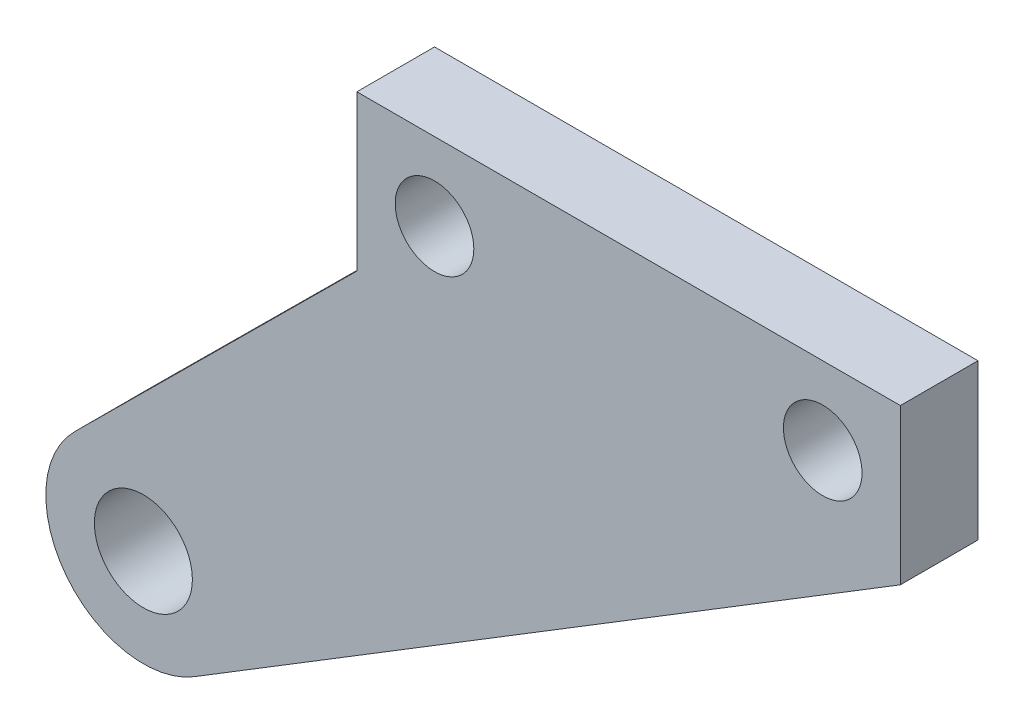
ISO-10303-21;
HEADER;
FILE_DESCRIPTION(('STEP AP214'),'2;1');
FILE_NAME('part.step','',(''),(''),'','','');
FILE_SCHEMA(('AUTOMOTIVE_DESIGN { 1 0 10303 214 1 1 1 1 }'));
ENDSEC;
DATA;
#1=APPLICATION_CONTEXT('core data for automotive mechanical design processes');
#2=APPLICATION_PROTOCOL_DEFINITION('international standard','automotive_design',2000,#1);
#3=PRODUCT_CONTEXT('',#1,'mechanical');
#4=PRODUCT('Part','Part','',(#3));
#5=PRODUCT_RELATED_PRODUCT_CATEGORY('part','',(#4));
#6=PRODUCT_DEFINITION_FORMATION('','',#4);
#7=PRODUCT_DEFINITION_CONTEXT('part definition',#1,'design');
#8=PRODUCT_DEFINITION('design','',#6,#7);
#9=PRODUCT_DEFINITION_SHAPE('','',#8);
#10=(LENGTH_UNIT() NAMED_UNIT(*) SI_UNIT(.MILLI.,.METRE.));
#11=(NAMED_UNIT(*) PLANE_ANGLE_UNIT() SI_UNIT($,.RADIAN.));
#12=(NAMED_UNIT(*) SI_UNIT($,.STERADIAN.) SOLID_ANGLE_UNIT());
#13=UNCERTAINTY_MEASURE_WITH_UNIT(LENGTH_MEASURE(1.E-05),#10,'distance_accuracy_value','');
#14=(GEOMETRIC_REPRESENTATION_CONTEXT(3) GLOBAL_UNCERTAINTY_ASSIGNED_CONTEXT((#13)) GLOBAL_UNIT_ASSIGNED_CONTEXT((#10,
#11,#12)) REPRESENTATION_CONTEXT('',''));
#15=CARTESIAN_POINT('',(0.,0.,0.));
#16=DIRECTION('',(0.,0.,1.));
#17=DIRECTION('',(1.,0.,0.));
#18=AXIS2_PLACEMENT_3D('',#15,#16,#17);
#19=CARTESIAN_POINT('',(-25.,-22.,2.));
#20=DIRECTION('',(0.,0.,1.));
#21=DIRECTION('',(1.,0.,0.));
#22=AXIS2_PLACEMENT_3D('',#19,#20,#21);
#23=PLANE('',#22);
#24=CARTESIAN_POINT('',(-10.,0.,2.));
#25=DIRECTION('',(0.,0.,1.));
#26=DIRECTION('',(1.,0.,0.));
#27=AXIS2_PLACEMENT_3D('',#24,#25,#26);
#28=CIRCLE('',#27,2.025);
#29=CARTESIAN_POINT('',(-7.975,0.,2.));
#30=VERTEX_POINT('',#29);
#31=EDGE_CURVE('E186',#30,#30,#28,.T.);
#32=ORIENTED_EDGE('',*,*,#31,.F.);
#33=EDGE_LOOP('',(#32));
#34=FACE_BOUND('',#33,.T.);
#35=DIRECTION('',(0.,-1.,0.));
#36=VECTOR('',#35,1.);
#37=CARTESIAN_POINT('',(-14.,4.,2.));
#38=LINE('',#37,#36);
#39=CARTESIAN_POINT('',(-14.,4.,2.));
#40=VERTEX_POINT('',#39);
#41=CARTESIAN_POINT('',(-14.,-4.,2.));
#42=VERTEX_POINT('',#41);
#43=EDGE_CURVE('E131',#40,#42,#38,.T.);
#44=ORIENTED_EDGE('',*,*,#43,.T.);
#45=DIRECTION('',(-0.709698080789205,-0.704505950382336,0.));
#46=VECTOR('',#45,1.);
#47=CARTESIAN_POINT('',(-14.,-4.,2.));
#48=LINE('',#47,#46);
#49=CARTESIAN_POINT('',(-28.5401424006712,-18.4337671440342,2.));
#50=VERTEX_POINT('',#49);
#51=EDGE_CURVE('E89',#42,#50,#48,.T.);
#52=ORIENTED_EDGE('',*,*,#51,.T.);
#53=CARTESIAN_POINT('',(-25.,-22.,2.));
#54=DIRECTION('',(0.,0.,1.));
#55=DIRECTION('',(1.,0.,0.));
#56=AXIS2_PLACEMENT_3D('',#53,#54,#55);
#57=CIRCLE('',#56,5.025);
#58=CARTESIAN_POINT('',(-22.3749389928446,-26.2848196821701,2.));
#59=VERTEX_POINT('',#58);
#60=EDGE_CURVE('E102',#50,#59,#57,.T.);
#61=ORIENTED_EDGE('',*,*,#60,.T.);
#62=DIRECTION('',(0.852700434262704,0.52240020042894,0.));
#63=VECTOR('',#62,1.);
#64=CARTESIAN_POINT('',(14.,-4.,2.));
#65=LINE('',#64,#63);
#66=CARTESIAN_POINT('',(14.,-4.,2.));
#67=VERTEX_POINT('',#66);
#68=EDGE_CURVE('E96',#59,#67,#65,.T.);
#69=ORIENTED_EDGE('',*,*,#68,.T.);
#70=DIRECTION('',(0.,1.,0.));
#71=VECTOR('',#70,1.);
#72=CARTESIAN_POINT('',(14.,4.,2.));
#73=LINE('',#72,#71);
#74=CARTESIAN_POINT('',(14.,4.,2.));
#75=VERTEX_POINT('',#74);
#76=EDGE_CURVE('E100',#67,#75,#73,.T.);
#77=ORIENTED_EDGE('',*,*,#76,.T.);
#78=DIRECTION('',(-1.,0.,0.));
#79=VECTOR('',#78,1.);
#80=CARTESIAN_POINT('',(-14.,4.,2.));
#81=LINE('',#80,#79);
#82=EDGE_CURVE('E52',#75,#40,#81,.T.);
#83=ORIENTED_EDGE('',*,*,#82,.T.);
#84=EDGE_LOOP('',(#44,#52,#61,#69,#77,#83));
#85=FACE_BOUND('',#84,.T.);
#86=CARTESIAN_POINT('',(10.,0.,2.));
#87=DIRECTION('',(0.,0.,1.));
#88=DIRECTION('',(1.,0.,0.));
#89=AXIS2_PLACEMENT_3D('',#86,#87,#88);
#90=CIRCLE('',#89,2.025);
#91=CARTESIAN_POINT('',(12.025,0.,2.));
#92=VERTEX_POINT('',#91);
#93=EDGE_CURVE('E124',#92,#92,#90,.T.);
#94=ORIENTED_EDGE('',*,*,#93,.F.);
#95=EDGE_LOOP('',(#94));
#96=FACE_BOUND('',#95,.T.);
#97=CARTESIAN_POINT('',(-25.,-22.,2.));
#98=DIRECTION('',(0.,0.,1.));
#99=DIRECTION('',(1.,0.,0.));
#100=AXIS2_PLACEMENT_3D('',#97,#98,#99);
#101=CIRCLE('',#100,2.525);
#102=CARTESIAN_POINT('',(-22.475,-22.,2.));
#103=VERTEX_POINT('',#102);
#104=EDGE_CURVE('E177',#103,#103,#101,.T.);
#105=ORIENTED_EDGE('',*,*,#104,.F.);
#106=EDGE_LOOP('',(#105));
#107=FACE_BOUND('',#106,.T.);
#108=ADVANCED_FACE('F35',(#34,#85,#96,#107),#23,.T.);
#109=CARTESIAN_POINT('',(-25.,-22.,-2.));
#110=DIRECTION('',(0.,0.,1.));
#111=DIRECTION('',(1.,0.,0.));
#112=AXIS2_PLACEMENT_3D('',#109,#110,#111);
#113=PLANE('',#112);
#114=DIRECTION('',(0.,-1.,0.));
#115=VECTOR('',#114,1.);
#116=CARTESIAN_POINT('',(-14.,4.,-2.));
#117=LINE('',#116,#115);
#118=CARTESIAN_POINT('',(-14.,4.,-2.));
#119=VERTEX_POINT('',#118);
#120=CARTESIAN_POINT('',(-14.,-4.,-2.));
#121=VERTEX_POINT('',#120);
#122=EDGE_CURVE('E120',#119,#121,#117,.T.);
#123=ORIENTED_EDGE('',*,*,#122,.F.);
#124=DIRECTION('',(-1.,0.,0.));
#125=VECTOR('',#124,1.);
#126=CARTESIAN_POINT('',(-14.,4.,-2.));
#127=LINE('',#126,#125);
#128=CARTESIAN_POINT('',(14.,4.,-2.));
#129=VERTEX_POINT('',#128);
#130=EDGE_CURVE('E81',#129,#119,#127,.T.);
#131=ORIENTED_EDGE('',*,*,#130,.F.);
#132=DIRECTION('',(0.,1.,0.));
#133=VECTOR('',#132,1.);
#134=CARTESIAN_POINT('',(14.,4.,-2.));
#135=LINE('',#134,#133);
#136=CARTESIAN_POINT('',(14.,-4.,-2.));
#137=VERTEX_POINT('',#136);
#138=EDGE_CURVE('E75',#137,#129,#135,.T.);
#139=ORIENTED_EDGE('',*,*,#138,.F.);
#140=DIRECTION('',(0.852700434262704,0.52240020042894,0.));
#141=VECTOR('',#140,1.);
#142=CARTESIAN_POINT('',(14.,-4.,-2.));
#143=LINE('',#142,#141);
#144=CARTESIAN_POINT('',(-22.3749389928446,-26.2848196821701,-2.));
#145=VERTEX_POINT('',#144);
#146=EDGE_CURVE('E110',#145,#137,#143,.T.);
#147=ORIENTED_EDGE('',*,*,#146,.F.);
#148=CARTESIAN_POINT('',(-25.,-22.,-2.));
#149=DIRECTION('',(0.,0.,1.));
#150=DIRECTION('',(1.,0.,0.));
#151=AXIS2_PLACEMENT_3D('',#148,#149,#150);
#152=CIRCLE('',#151,5.025);
#153=CARTESIAN_POINT('',(-28.5401424006712,-18.4337671440342,-2.));
#154=VERTEX_POINT('',#153);
#155=EDGE_CURVE('E126',#154,#145,#152,.T.);
#156=ORIENTED_EDGE('',*,*,#155,.F.);
#157=DIRECTION('',(-0.709698080789205,-0.704505950382336,0.));
#158=VECTOR('',#157,1.);
#159=CARTESIAN_POINT('',(-14.,-4.,-2.));
#160=LINE('',#159,#158);
#161=EDGE_CURVE('E123',#121,#154,#160,.T.);
#162=ORIENTED_EDGE('',*,*,#161,.F.);
#163=EDGE_LOOP('',(#123,#131,#139,#147,#156,#162));
#164=FACE_BOUND('',#163,.T.);
#165=CARTESIAN_POINT('',(10.,0.,-2.));
#166=DIRECTION('',(0.,0.,1.));
#167=DIRECTION('',(1.,0.,0.));
#168=AXIS2_PLACEMENT_3D('',#165,#166,#167);
#169=CIRCLE('',#168,2.025);
#170=CARTESIAN_POINT('',(12.025,0.,-2.));
#171=VERTEX_POINT('',#170);
#172=EDGE_CURVE('E189',#171,#171,#169,.T.);
#173=ORIENTED_EDGE('',*,*,#172,.T.);
#174=EDGE_LOOP('',(#173));
#175=FACE_BOUND('',#174,.T.);
#176=CARTESIAN_POINT('',(-10.,0.,-2.));
#177=DIRECTION('',(0.,0.,1.));
#178=DIRECTION('',(1.,0.,0.));
#179=AXIS2_PLACEMENT_3D('',#176,#177,#178);
#180=CIRCLE('',#179,2.025);
#181=CARTESIAN_POINT('',(-7.975,0.,-2.));
#182=VERTEX_POINT('',#181);
#183=EDGE_CURVE('E183',#182,#182,#180,.T.);
#184=ORIENTED_EDGE('',*,*,#183,.T.);
#185=EDGE_LOOP('',(#184));
#186=FACE_BOUND('',#185,.T.);
#187=CARTESIAN_POINT('',(-25.,-22.,-2.));
#188=DIRECTION('',(0.,0.,1.));
#189=DIRECTION('',(1.,0.,0.));
#190=AXIS2_PLACEMENT_3D('',#187,#188,#189);
#191=CIRCLE('',#190,2.525);
#192=CARTESIAN_POINT('',(-22.475,-22.,-2.));
#193=VERTEX_POINT('',#192);
#194=EDGE_CURVE('E180',#193,#193,#191,.T.);
#195=ORIENTED_EDGE('',*,*,#194,.T.);
#196=EDGE_LOOP('',(#195));
#197=FACE_BOUND('',#196,.T.);
#198=ADVANCED_FACE('F140',(#164,#175,#186,#197),#113,.F.);
#199=CARTESIAN_POINT('',(-14.,4.,2.));
#200=DIRECTION('',(1.,0.,0.));
#201=DIRECTION('',(0.,1.,0.));
#202=AXIS2_PLACEMENT_3D('',#199,#200,#201);
#203=PLANE('',#202);
#204=ORIENTED_EDGE('',*,*,#122,.T.);
#205=DIRECTION('',(0.,0.,-1.));
#206=VECTOR('',#205,1.);
#207=CARTESIAN_POINT('',(-14.,-4.,2.));
#208=LINE('',#207,#206);
#209=EDGE_CURVE('E11',#42,#121,#208,.T.);
#210=ORIENTED_EDGE('',*,*,#209,.F.);
#211=ORIENTED_EDGE('',*,*,#43,.F.);
#212=DIRECTION('',(0.,0.,-1.));
#213=VECTOR('',#212,1.);
#214=CARTESIAN_POINT('',(-14.,4.,2.));
#215=LINE('',#214,#213);
#216=EDGE_CURVE('E116',#40,#119,#215,.T.);
#217=ORIENTED_EDGE('',*,*,#216,.T.);
#218=EDGE_LOOP('',(#204,#210,#211,#217));
#219=FACE_BOUND('',#218,.T.);
#220=ADVANCED_FACE('F37',(#219),#203,.F.);
#221=CARTESIAN_POINT('',(-14.,-4.,2.));
#222=DIRECTION('',(0.704505950382336,-0.709698080789206,0.));
#223=DIRECTION('',(0.709698080789206,0.704505950382336,0.));
#224=AXIS2_PLACEMENT_3D('',#221,#222,#223);
#225=PLANE('',#224);
#226=ORIENTED_EDGE('',*,*,#161,.T.);
#227=DIRECTION('',(0.,0.,-1.));
#228=VECTOR('',#227,1.);
#229=CARTESIAN_POINT('',(-28.5401424006712,-18.4337671440342,2.));
#230=LINE('',#229,#228);
#231=EDGE_CURVE('E44',#50,#154,#230,.T.);
#232=ORIENTED_EDGE('',*,*,#231,.F.);
#233=ORIENTED_EDGE('',*,*,#51,.F.);
#234=ORIENTED_EDGE('',*,*,#209,.T.);
#235=EDGE_LOOP('',(#226,#232,#233,#234));
#236=FACE_BOUND('',#235,.T.);
#237=ADVANCED_FACE('F239',(#236),#225,.F.);
#238=CARTESIAN_POINT('',(-25.,-22.,2.));
#239=DIRECTION('',(0.,0.,-1.));
#240=DIRECTION('',(-1.,0.,0.));
#241=AXIS2_PLACEMENT_3D('',#238,#239,#240);
#242=CYLINDRICAL_SURFACE('',#241,5.025);
#243=ORIENTED_EDGE('',*,*,#155,.T.);
#244=DIRECTION('',(0.,0.,-1.));
#245=VECTOR('',#244,1.);
#246=CARTESIAN_POINT('',(-22.3749389928446,-26.2848196821701,2.));
#247=LINE('',#246,#245);
#248=EDGE_CURVE('E111',#59,#145,#247,.T.);
#249=ORIENTED_EDGE('',*,*,#248,.F.);
#250=ORIENTED_EDGE('',*,*,#60,.F.);
#251=ORIENTED_EDGE('',*,*,#231,.T.);
#252=EDGE_LOOP('',(#243,#249,#250,#251));
#253=FACE_BOUND('',#252,.T.);
#254=ADVANCED_FACE('F137',(#253),#242,.T.);
#255=CARTESIAN_POINT('',(14.,-4.,2.));
#256=DIRECTION('',(-0.52240020042894,0.852700434262704,0.));
#257=DIRECTION('',(-0.852700434262704,-0.52240020042894,0.));
#258=AXIS2_PLACEMENT_3D('',#255,#256,#257);
#259=PLANE('',#258);
#260=ORIENTED_EDGE('',*,*,#146,.T.);
#261=DIRECTION('',(0.,0.,-1.));
#262=VECTOR('',#261,1.);
#263=CARTESIAN_POINT('',(14.,-4.,2.));
#264=LINE('',#263,#262);
#265=EDGE_CURVE('E107',#67,#137,#264,.T.);
#266=ORIENTED_EDGE('',*,*,#265,.F.);
#267=ORIENTED_EDGE('',*,*,#68,.F.);
#268=ORIENTED_EDGE('',*,*,#248,.T.);
#269=EDGE_LOOP('',(#260,#266,#267,#268));
#270=FACE_BOUND('',#269,.T.);
#271=ADVANCED_FACE('F108',(#270),#259,.F.);
#272=CARTESIAN_POINT('',(14.,4.,2.));
#273=DIRECTION('',(-1.,0.,0.));
#274=DIRECTION('',(0.,0.,1.));
#275=AXIS2_PLACEMENT_3D('',#272,#273,#274);
#276=PLANE('',#275);
#277=ORIENTED_EDGE('',*,*,#138,.T.);
#278=DIRECTION('',(0.,0.,-1.));
#279=VECTOR('',#278,1.);
#280=CARTESIAN_POINT('',(14.,4.,2.));
#281=LINE('',#280,#279);
#282=EDGE_CURVE('E112',#75,#129,#281,.T.);
#283=ORIENTED_EDGE('',*,*,#282,.F.);
#284=ORIENTED_EDGE('',*,*,#76,.F.);
#285=ORIENTED_EDGE('',*,*,#265,.T.);
#286=EDGE_LOOP('',(#277,#283,#284,#285));
#287=FACE_BOUND('',#286,.T.);
#288=ADVANCED_FACE('F114',(#287),#276,.F.);
#289=CARTESIAN_POINT('',(-14.,4.,2.));
#290=DIRECTION('',(0.,-1.,0.));
#291=DIRECTION('',(0.,0.,-1.));
#292=AXIS2_PLACEMENT_3D('',#289,#290,#291);
#293=PLANE('',#292);
#294=ORIENTED_EDGE('',*,*,#130,.T.);
#295=ORIENTED_EDGE('',*,*,#216,.F.);
#296=ORIENTED_EDGE('',*,*,#82,.F.);
#297=ORIENTED_EDGE('',*,*,#282,.T.);
#298=EDGE_LOOP('',(#294,#295,#296,#297));
#299=FACE_BOUND('',#298,.T.);
#300=ADVANCED_FACE('F145',(#299),#293,.F.);
#301=CARTESIAN_POINT('',(10.,0.,2.));
#302=DIRECTION('',(0.,0.,-1.));
#303=DIRECTION('',(-1.,0.,0.));
#304=AXIS2_PLACEMENT_3D('',#301,#302,#303);
#305=CYLINDRICAL_SURFACE('',#304,2.025);
#306=ORIENTED_EDGE('',*,*,#93,.T.);
#307=EDGE_LOOP('',(#306));
#308=FACE_BOUND('',#307,.T.);
#309=ORIENTED_EDGE('',*,*,#172,.F.);
#310=EDGE_LOOP('',(#309));
#311=FACE_BOUND('',#310,.T.);
#312=ADVANCED_FACE('F147',(#308,#311),#305,.F.);
#313=CARTESIAN_POINT('',(-10.,0.,2.));
#314=DIRECTION('',(0.,0.,-1.));
#315=DIRECTION('',(-1.,0.,0.));
#316=AXIS2_PLACEMENT_3D('',#313,#314,#315);
#317=CYLINDRICAL_SURFACE('',#316,2.025);
#318=ORIENTED_EDGE('',*,*,#31,.T.);
#319=EDGE_LOOP('',(#318));
#320=FACE_BOUND('',#319,.T.);
#321=ORIENTED_EDGE('',*,*,#183,.F.);
#322=EDGE_LOOP('',(#321));
#323=FACE_BOUND('',#322,.T.);
#324=ADVANCED_FACE('F153',(#320,#323),#317,.F.);
#325=CARTESIAN_POINT('',(-25.,-22.,2.));
#326=DIRECTION('',(0.,0.,-1.));
#327=DIRECTION('',(-1.,0.,0.));
#328=AXIS2_PLACEMENT_3D('',#325,#326,#327);
#329=CYLINDRICAL_SURFACE('',#328,2.525);
#330=ORIENTED_EDGE('',*,*,#104,.T.);
#331=EDGE_LOOP('',(#330));
#332=FACE_BOUND('',#331,.T.);
#333=ORIENTED_EDGE('',*,*,#194,.F.);
#334=EDGE_LOOP('',(#333));
#335=FACE_BOUND('',#334,.T.);
#336=ADVANCED_FACE('F168',(#332,#335),#329,.F.);
#337=CLOSED_SHELL('',(#108,#198,#220,#237,#254,#271,#288,#300,#312,#324,#336));
#338=MANIFOLD_SOLID_BREP('B2',#337);
#339=ADVANCED_BREP_SHAPE_REPRESENTATION('',(#18,#338),#14);
#340=SHAPE_DEFINITION_REPRESENTATION(#9,#339);
ENDSEC;
END-ISO-10303-21;
